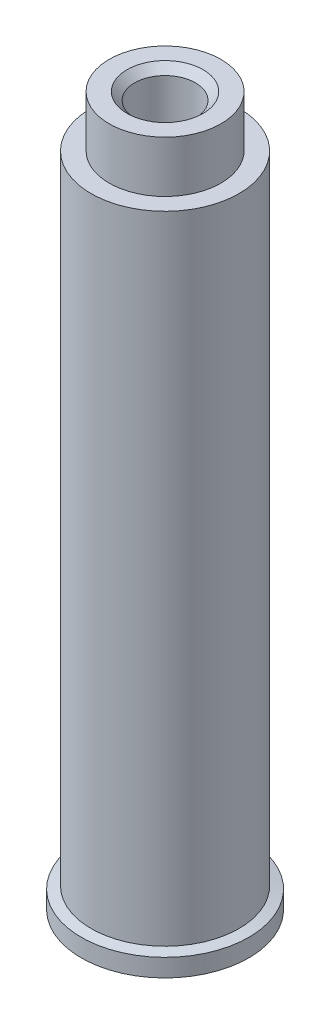
ISO-10303-21;
HEADER;
FILE_DESCRIPTION(('STEP AP214'),'2;1');
FILE_NAME('part.step','',(''),(''),'','','');
FILE_SCHEMA(('AUTOMOTIVE_DESIGN { 1 0 10303 214 1 1 1 1 }'));
ENDSEC;
DATA;
#1=APPLICATION_CONTEXT('core data for automotive mechanical design processes');
#2=APPLICATION_PROTOCOL_DEFINITION('international standard','automotive_design',2000,#1);
#3=PRODUCT_CONTEXT('',#1,'mechanical');
#4=PRODUCT('Part','Part','',(#3));
#5=PRODUCT_RELATED_PRODUCT_CATEGORY('part','',(#4));
#6=PRODUCT_DEFINITION_FORMATION('','',#4);
#7=PRODUCT_DEFINITION_CONTEXT('part definition',#1,'design');
#8=PRODUCT_DEFINITION('design','',#6,#7);
#9=PRODUCT_DEFINITION_SHAPE('','',#8);
#10=(LENGTH_UNIT() NAMED_UNIT(*) SI_UNIT(.MILLI.,.METRE.));
#11=(NAMED_UNIT(*) PLANE_ANGLE_UNIT() SI_UNIT($,.RADIAN.));
#12=(NAMED_UNIT(*) SI_UNIT($,.STERADIAN.) SOLID_ANGLE_UNIT());
#13=UNCERTAINTY_MEASURE_WITH_UNIT(LENGTH_MEASURE(1.E-05),#10,'distance_accuracy_value','');
#14=(GEOMETRIC_REPRESENTATION_CONTEXT(3) GLOBAL_UNCERTAINTY_ASSIGNED_CONTEXT((#13)) GLOBAL_UNIT_ASSIGNED_CONTEXT((#10,
#11,#12)) REPRESENTATION_CONTEXT('',''));
#15=CARTESIAN_POINT('',(0.,0.,0.));
#16=DIRECTION('',(0.,0.,1.));
#17=DIRECTION('',(1.,0.,0.));
#18=AXIS2_PLACEMENT_3D('',#15,#16,#17);
#19=CARTESIAN_POINT('',(4.7625,-11.938,0.));
#20=DIRECTION('',(0.,-1.,0.));
#21=DIRECTION('',(0.,0.,-1.));
#22=AXIS2_PLACEMENT_3D('',#19,#20,#21);
#23=PLANE('',#22);
#24=CARTESIAN_POINT('',(0.,-11.938,0.));
#25=DIRECTION('',(0.,-1.,0.));
#26=DIRECTION('',(0.,0.,-1.));
#27=AXIS2_PLACEMENT_3D('',#24,#25,#26);
#28=CIRCLE('',#27,4.7625);
#29=CARTESIAN_POINT('',(0.,-11.938,-4.7625));
#30=VERTEX_POINT('',#29);
#31=EDGE_CURVE('E71',#30,#30,#28,.T.);
#32=ORIENTED_EDGE('',*,*,#31,.T.);
#33=EDGE_LOOP('',(#32));
#34=FACE_BOUND('',#33,.T.);
#35=CARTESIAN_POINT('',(0.,-11.938,0.));
#36=DIRECTION('',(0.,-1.,0.));
#37=DIRECTION('',(0.,0.,-1.));
#38=AXIS2_PLACEMENT_3D('',#35,#36,#37);
#39=CIRCLE('',#38,3.9751);
#40=CARTESIAN_POINT('',(0.,-11.938,-3.9751));
#41=VERTEX_POINT('',#40);
#42=EDGE_CURVE('E10',#41,#41,#39,.T.);
#43=ORIENTED_EDGE('',*,*,#42,.F.);
#44=EDGE_LOOP('',(#43));
#45=FACE_BOUND('',#44,.T.);
#46=ADVANCED_FACE('F34',(#34,#45),#23,.T.);
#47=CARTESIAN_POINT('',(0.,-164.610288723648,0.));
#48=DIRECTION('',(0.,-1.,0.));
#49=DIRECTION('',(0.,0.,-1.));
#50=AXIS2_PLACEMENT_3D('',#47,#48,#49);
#51=CYLINDRICAL_SURFACE('',#50,3.9751);
#52=ORIENTED_EDGE('',*,*,#42,.T.);
#53=EDGE_LOOP('',(#52));
#54=FACE_BOUND('',#53,.T.);
#55=CARTESIAN_POINT('',(0.,22.987,0.));
#56=DIRECTION('',(0.,-1.,0.));
#57=DIRECTION('',(0.,0.,-1.));
#58=AXIS2_PLACEMENT_3D('',#55,#56,#57);
#59=CIRCLE('',#58,3.9751);
#60=CARTESIAN_POINT('',(0.,22.987,-3.9751));
#61=VERTEX_POINT('',#60);
#62=EDGE_CURVE('E40',#61,#61,#59,.T.);
#63=ORIENTED_EDGE('',*,*,#62,.F.);
#64=EDGE_LOOP('',(#63));
#65=FACE_BOUND('',#64,.T.);
#66=ADVANCED_FACE('F89',(#54,#65),#51,.F.);
#67=CARTESIAN_POINT('',(0.,24.2848256701114,0.));
#68=DIRECTION('',(0.,-1.,0.));
#69=DIRECTION('',(0.,0.,-1.));
#70=AXIS2_PLACEMENT_3D('',#67,#68,#69);
#71=CONICAL_SURFACE('',#70,1.7272,1.0471975511966);
#72=ORIENTED_EDGE('',*,*,#62,.T.);
#73=EDGE_LOOP('',(#72));
#74=FACE_BOUND('',#73,.T.);
#75=CARTESIAN_POINT('',(0.,24.2848256701114,0.));
#76=DIRECTION('',(0.,-1.,0.));
#77=DIRECTION('',(0.,0.,-1.));
#78=AXIS2_PLACEMENT_3D('',#75,#76,#77);
#79=CIRCLE('',#78,1.7272);
#80=CARTESIAN_POINT('',(0.,24.2848256701114,-1.7272));
#81=VERTEX_POINT('',#80);
#82=EDGE_CURVE('E44',#81,#81,#79,.T.);
#83=ORIENTED_EDGE('',*,*,#82,.F.);
#84=EDGE_LOOP('',(#83));
#85=FACE_BOUND('',#84,.T.);
#86=ADVANCED_FACE('F93',(#74,#85),#71,.F.);
#87=CARTESIAN_POINT('',(0.,-164.610288723648,0.));
#88=DIRECTION('',(0.,-1.,0.));
#89=DIRECTION('',(0.,0.,-1.));
#90=AXIS2_PLACEMENT_3D('',#87,#88,#89);
#91=CYLINDRICAL_SURFACE('',#90,1.7272);
#92=ORIENTED_EDGE('',*,*,#82,.T.);
#93=EDGE_LOOP('',(#92));
#94=FACE_BOUND('',#93,.T.);
#95=CARTESIAN_POINT('',(0.,27.8892,0.));
#96=DIRECTION('',(0.,-1.,0.));
#97=DIRECTION('',(0.,0.,-1.));
#98=AXIS2_PLACEMENT_3D('',#95,#96,#97);
#99=CIRCLE('',#98,1.7272);
#100=CARTESIAN_POINT('',(0.,27.8892,-1.7272));
#101=VERTEX_POINT('',#100);
#102=EDGE_CURVE('E48',#101,#101,#99,.T.);
#103=ORIENTED_EDGE('',*,*,#102,.F.);
#104=EDGE_LOOP('',(#103));
#105=FACE_BOUND('',#104,.T.);
#106=ADVANCED_FACE('F97',(#94,#105),#91,.F.);
#107=CARTESIAN_POINT('',(0.,28.321,0.));
#108=DIRECTION('',(0.,1.,0.));
#109=DIRECTION('',(0.,0.,1.));
#110=AXIS2_PLACEMENT_3D('',#107,#108,#109);
#111=CONICAL_SURFACE('',#110,2.15899999999999,0.785398163397468);
#112=ORIENTED_EDGE('',*,*,#102,.T.);
#113=EDGE_LOOP('',(#112));
#114=FACE_BOUND('',#113,.T.);
#115=CARTESIAN_POINT('',(0.,28.321,0.));
#116=DIRECTION('',(0.,-1.,0.));
#117=DIRECTION('',(0.,0.,-1.));
#118=AXIS2_PLACEMENT_3D('',#115,#116,#117);
#119=CIRCLE('',#118,2.15899999999999);
#120=CARTESIAN_POINT('',(0.,28.321,-2.15899999999999));
#121=VERTEX_POINT('',#120);
#122=EDGE_CURVE('E53',#121,#121,#119,.T.);
#123=ORIENTED_EDGE('',*,*,#122,.F.);
#124=EDGE_LOOP('',(#123));
#125=FACE_BOUND('',#124,.T.);
#126=ADVANCED_FACE('F103',(#114,#125),#111,.F.);
#127=CARTESIAN_POINT('',(2.15899999999999,28.321,0.));
#128=DIRECTION('',(0.,1.,0.));
#129=DIRECTION('',(0.,0.,1.));
#130=AXIS2_PLACEMENT_3D('',#127,#128,#129);
#131=PLANE('',#130);
#132=ORIENTED_EDGE('',*,*,#122,.T.);
#133=EDGE_LOOP('',(#132));
#134=FACE_BOUND('',#133,.T.);
#135=CARTESIAN_POINT('',(0.,28.321,0.));
#136=DIRECTION('',(0.,-1.,0.));
#137=DIRECTION('',(0.,0.,-1.));
#138=AXIS2_PLACEMENT_3D('',#135,#136,#137);
#139=CIRCLE('',#138,3.17499999999999);
#140=CARTESIAN_POINT('',(0.,28.321,-3.17499999999999));
#141=VERTEX_POINT('',#140);
#142=EDGE_CURVE('E56',#141,#141,#139,.T.);
#143=ORIENTED_EDGE('',*,*,#142,.F.);
#144=EDGE_LOOP('',(#143));
#145=FACE_BOUND('',#144,.T.);
#146=ADVANCED_FACE('F107',(#134,#145),#131,.T.);
#147=CARTESIAN_POINT('',(0.,-164.610288723648,0.));
#148=DIRECTION('',(0.,-1.,0.));
#149=DIRECTION('',(0.,0.,-1.));
#150=AXIS2_PLACEMENT_3D('',#147,#148,#149);
#151=CYLINDRICAL_SURFACE('',#150,3.175);
#152=ORIENTED_EDGE('',*,*,#142,.T.);
#153=EDGE_LOOP('',(#152));
#154=FACE_BOUND('',#153,.T.);
#155=CARTESIAN_POINT('',(0.,25.4,0.));
#156=DIRECTION('',(0.,-1.,0.));
#157=DIRECTION('',(0.,0.,-1.));
#158=AXIS2_PLACEMENT_3D('',#155,#156,#157);
#159=CIRCLE('',#158,3.175);
#160=CARTESIAN_POINT('',(0.,25.4,-3.175));
#161=VERTEX_POINT('',#160);
#162=EDGE_CURVE('E59',#161,#161,#159,.T.);
#163=ORIENTED_EDGE('',*,*,#162,.F.);
#164=EDGE_LOOP('',(#163));
#165=FACE_BOUND('',#164,.T.);
#166=ADVANCED_FACE('F111',(#154,#165),#151,.T.);
#167=CARTESIAN_POINT('',(3.175,25.4,0.));
#168=DIRECTION('',(0.,1.,0.));
#169=DIRECTION('',(0.,0.,1.));
#170=AXIS2_PLACEMENT_3D('',#167,#168,#169);
#171=PLANE('',#170);
#172=ORIENTED_EDGE('',*,*,#162,.T.);
#173=EDGE_LOOP('',(#172));
#174=FACE_BOUND('',#173,.T.);
#175=CARTESIAN_POINT('',(0.,25.4,0.));
#176=DIRECTION('',(0.,-1.,0.));
#177=DIRECTION('',(0.,0.,-1.));
#178=AXIS2_PLACEMENT_3D('',#175,#176,#177);
#179=CIRCLE('',#178,4.2037);
#180=CARTESIAN_POINT('',(0.,25.4,-4.2037));
#181=VERTEX_POINT('',#180);
#182=EDGE_CURVE('E62',#181,#181,#179,.T.);
#183=ORIENTED_EDGE('',*,*,#182,.F.);
#184=EDGE_LOOP('',(#183));
#185=FACE_BOUND('',#184,.T.);
#186=ADVANCED_FACE('F115',(#174,#185),#171,.T.);
#187=CARTESIAN_POINT('',(0.,-164.610288723648,0.));
#188=DIRECTION('',(0.,-1.,0.));
#189=DIRECTION('',(0.,0.,-1.));
#190=AXIS2_PLACEMENT_3D('',#187,#188,#189);
#191=CYLINDRICAL_SURFACE('',#190,4.2037);
#192=ORIENTED_EDGE('',*,*,#182,.T.);
#193=EDGE_LOOP('',(#192));
#194=FACE_BOUND('',#193,.T.);
#195=CARTESIAN_POINT('',(0.,-10.7722699912695,0.));
#196=DIRECTION('',(0.,-1.,0.));
#197=DIRECTION('',(0.,0.,-1.));
#198=AXIS2_PLACEMENT_3D('',#195,#196,#197);
#199=CIRCLE('',#198,4.2037);
#200=CARTESIAN_POINT('',(0.,-10.7722699912695,-4.2037));
#201=VERTEX_POINT('',#200);
#202=EDGE_CURVE('E65',#201,#201,#199,.T.);
#203=ORIENTED_EDGE('',*,*,#202,.F.);
#204=EDGE_LOOP('',(#203));
#205=FACE_BOUND('',#204,.T.);
#206=ADVANCED_FACE('F85',(#194,#205),#191,.T.);
#207=CARTESIAN_POINT('',(0.,-10.922,0.));
#208=DIRECTION('',(0.,-1.,0.));
#209=DIRECTION('',(0.,0.,-1.));
#210=AXIS2_PLACEMENT_3D('',#207,#208,#209);
#211=CONICAL_SURFACE('',#210,4.7625,1.30899693899576);
#212=ORIENTED_EDGE('',*,*,#202,.T.);
#213=EDGE_LOOP('',(#212));
#214=FACE_BOUND('',#213,.T.);
#215=CARTESIAN_POINT('',(0.,-10.922,0.));
#216=DIRECTION('',(0.,-1.,0.));
#217=DIRECTION('',(0.,0.,-1.));
#218=AXIS2_PLACEMENT_3D('',#215,#216,#217);
#219=CIRCLE('',#218,4.7625);
#220=CARTESIAN_POINT('',(0.,-10.922,-4.7625));
#221=VERTEX_POINT('',#220);
#222=EDGE_CURVE('E68',#221,#221,#219,.T.);
#223=ORIENTED_EDGE('',*,*,#222,.F.);
#224=EDGE_LOOP('',(#223));
#225=FACE_BOUND('',#224,.T.);
#226=ADVANCED_FACE('F79',(#214,#225),#211,.T.);
#227=CARTESIAN_POINT('',(0.,-164.610288723648,0.));
#228=DIRECTION('',(0.,-1.,0.));
#229=DIRECTION('',(0.,0.,-1.));
#230=AXIS2_PLACEMENT_3D('',#227,#228,#229);
#231=CYLINDRICAL_SURFACE('',#230,4.7625);
#232=ORIENTED_EDGE('',*,*,#222,.T.);
#233=EDGE_LOOP('',(#232));
#234=FACE_BOUND('',#233,.T.);
#235=ORIENTED_EDGE('',*,*,#31,.F.);
#236=EDGE_LOOP('',(#235));
#237=FACE_BOUND('',#236,.T.);
#238=ADVANCED_FACE('F77',(#234,#237),#231,.T.);
#239=CLOSED_SHELL('',(#46,#66,#86,#106,#126,#146,#166,#186,#206,#226,#238));
#240=MANIFOLD_SOLID_BREP('B2',#239);
#241=ADVANCED_BREP_SHAPE_REPRESENTATION('',(#18,#240),#14);
#242=SHAPE_DEFINITION_REPRESENTATION(#9,#241);
ENDSEC;
END-ISO-10303-21;
